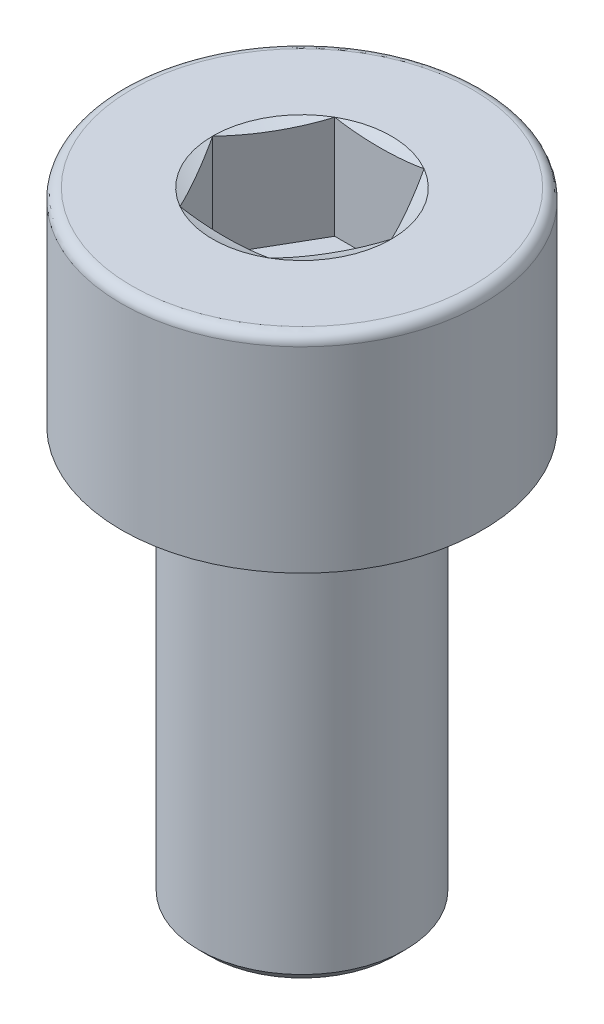
ISO-10303-21;
HEADER;
FILE_DESCRIPTION(('STEP AP214'),'2;1');
FILE_NAME('part.step','',(''),(''),'','','');
FILE_SCHEMA(('AUTOMOTIVE_DESIGN { 1 0 10303 214 1 1 1 1 }'));
ENDSEC;
DATA;
#1=APPLICATION_CONTEXT('core data for automotive mechanical design processes');
#2=APPLICATION_PROTOCOL_DEFINITION('international standard','automotive_design',2000,#1);
#3=PRODUCT_CONTEXT('',#1,'mechanical');
#4=PRODUCT('Part','Part','',(#3));
#5=PRODUCT_RELATED_PRODUCT_CATEGORY('part','',(#4));
#6=PRODUCT_DEFINITION_FORMATION('','',#4);
#7=PRODUCT_DEFINITION_CONTEXT('part definition',#1,'design');
#8=PRODUCT_DEFINITION('design','',#6,#7);
#9=PRODUCT_DEFINITION_SHAPE('','',#8);
#10=(LENGTH_UNIT() NAMED_UNIT(*) SI_UNIT(.MILLI.,.METRE.));
#11=(NAMED_UNIT(*) PLANE_ANGLE_UNIT() SI_UNIT($,.RADIAN.));
#12=(NAMED_UNIT(*) SI_UNIT($,.STERADIAN.) SOLID_ANGLE_UNIT());
#13=UNCERTAINTY_MEASURE_WITH_UNIT(LENGTH_MEASURE(1.E-05),#10,'distance_accuracy_value','');
#14=(GEOMETRIC_REPRESENTATION_CONTEXT(3) GLOBAL_UNCERTAINTY_ASSIGNED_CONTEXT((#13)) GLOBAL_UNIT_ASSIGNED_CONTEXT((#10,
#11,#12)) REPRESENTATION_CONTEXT('',''));
#15=CARTESIAN_POINT('',(0.,0.,0.));
#16=DIRECTION('',(0.,0.,1.));
#17=DIRECTION('',(1.,0.,0.));
#18=AXIS2_PLACEMENT_3D('',#15,#16,#17);
#19=CARTESIAN_POINT('',(-0.866025403784439,2.,-1.5));
#20=DIRECTION('',(0.,-1.,0.));
#21=DIRECTION('',(0.,0.,-1.));
#22=AXIS2_PLACEMENT_3D('',#19,#20,#21);
#23=PLANE('',#22);
#24=DIRECTION('',(0.5,0.,0.866025403784439));
#25=VECTOR('',#24,1.);
#26=CARTESIAN_POINT('',(-0.866025403784439,2.,1.5));
#27=LINE('',#26,#25);
#28=CARTESIAN_POINT('',(-1.73205080756888,2.,0.));
#29=VERTEX_POINT('',#28);
#30=CARTESIAN_POINT('',(-0.866025403784439,2.,1.5));
#31=VERTEX_POINT('',#30);
#32=EDGE_CURVE('E233',#29,#31,#27,.T.);
#33=ORIENTED_EDGE('',*,*,#32,.T.);
#34=DIRECTION('',(1.,0.,0.));
#35=VECTOR('',#34,1.);
#36=CARTESIAN_POINT('',(0.866025403784439,2.,1.5));
#37=LINE('',#36,#35);
#38=CARTESIAN_POINT('',(0.866025403784438,2.,1.5));
#39=VERTEX_POINT('',#38);
#40=EDGE_CURVE('E237',#31,#39,#37,.T.);
#41=ORIENTED_EDGE('',*,*,#40,.T.);
#42=DIRECTION('',(0.5,0.,-0.866025403784438));
#43=VECTOR('',#42,1.);
#44=CARTESIAN_POINT('',(1.73205080756888,2.,0.));
#45=LINE('',#44,#43);
#46=CARTESIAN_POINT('',(1.73205080756888,2.,0.));
#47=VERTEX_POINT('',#46);
#48=EDGE_CURVE('E240',#39,#47,#45,.T.);
#49=ORIENTED_EDGE('',*,*,#48,.T.);
#50=DIRECTION('',(-0.5,0.,-0.866025403784439));
#51=VECTOR('',#50,1.);
#52=CARTESIAN_POINT('',(0.866025403784439,2.,-1.5));
#53=LINE('',#52,#51);
#54=CARTESIAN_POINT('',(0.866025403784439,2.,-1.5));
#55=VERTEX_POINT('',#54);
#56=EDGE_CURVE('E96',#47,#55,#53,.T.);
#57=ORIENTED_EDGE('',*,*,#56,.T.);
#58=DIRECTION('',(-1.,0.,0.));
#59=VECTOR('',#58,1.);
#60=CARTESIAN_POINT('',(-0.866025403784439,2.,-1.5));
#61=LINE('',#60,#59);
#62=CARTESIAN_POINT('',(-0.866025403784439,2.,-1.5));
#63=VERTEX_POINT('',#62);
#64=EDGE_CURVE('E223',#55,#63,#61,.T.);
#65=ORIENTED_EDGE('',*,*,#64,.T.);
#66=DIRECTION('',(-0.5,0.,0.866025403784439));
#67=VECTOR('',#66,1.);
#68=CARTESIAN_POINT('',(-1.73205080756888,2.,0.));
#69=LINE('',#68,#67);
#70=EDGE_CURVE('E228',#63,#29,#69,.T.);
#71=ORIENTED_EDGE('',*,*,#70,.T.);
#72=EDGE_LOOP('',(#33,#41,#49,#57,#65,#71));
#73=FACE_BOUND('',#72,.T.);
#74=ADVANCED_FACE('F17',(#73),#23,.F.);
#75=CARTESIAN_POINT('',(1.73205080756888,2.,0.));
#76=DIRECTION('',(0.866025403784438,0.,0.5));
#77=DIRECTION('',(0.5,0.,-0.866025403784438));
#78=AXIS2_PLACEMENT_3D('',#75,#76,#77);
#79=PLANE('',#78);
#80=CARTESIAN_POINT('',(0.866025403784439,4.,1.5));
#81=CARTESIAN_POINT('',(0.915504075147133,3.98189582699173,1.41430042730881));
#82=CARTESIAN_POINT('',(0.965286089839679,3.96746130454607,1.32807544855818));
#83=CARTESIAN_POINT('',(1.04010320937937,3.95073670465878,1.19848839623948));
#84=CARTESIAN_POINT('',(1.06500195161915,3.94598898296402,1.15536250963562));
#85=CARTESIAN_POINT('',(1.11486455236407,3.93800945270095,1.0689979517479));
#86=CARTESIAN_POINT('',(1.13982842404438,3.93477797939708,1.02575925764398));
#87=CARTESIAN_POINT('',(1.2119715040795,3.92751872155022,0.900803777608636));
#88=CARTESIAN_POINT('',(1.25919960491255,3.92533045525273,0.819002307420801));
#89=CARTESIAN_POINT('',(1.35364574634637,3.92584627574942,0.655416791878586));
#90=CARTESIAN_POINT('',(1.40086378687052,3.92855039856217,0.573632746656925));
#91=CARTESIAN_POINT('',(1.4956233423575,3.9391641982793,0.409504382050834));
#92=CARTESIAN_POINT('',(1.54316353081018,3.94712430077153,0.327162360249381));
#93=CARTESIAN_POINT('',(1.63791125772031,3.96895972056791,0.163054483339385));
#94=CARTESIAN_POINT('',(1.68511871136698,3.98283649422536,0.0812887751273956));
#95=CARTESIAN_POINT('',(1.73205080756888,4.,0.));
#96=B_SPLINE_CURVE_WITH_KNOTS('',3,(#80,#81,#82,#83,#84,#85,#86,#87,#88,#89,#90,#91,#92,#93,#94,
#95),.UNSPECIFIED.,.F.,.F.,(4,2,2,2,2,2,2,4),(0.,0.301631287017592,0.4516759741211,
0.6017538226571,0.885054753264525,1.16835776958803,1.45441905905587,1.74055080148907),.UNSPECIFIED.);
#97=CARTESIAN_POINT('',(0.866025403784439,4.,1.5));
#98=VERTEX_POINT('',#97);
#99=CARTESIAN_POINT('',(1.73205080756888,4.,0.));
#100=VERTEX_POINT('',#99);
#101=EDGE_CURVE('E79',#98,#100,#96,.T.);
#102=ORIENTED_EDGE('',*,*,#101,.T.);
#103=DIRECTION('',(0.,1.,0.));
#104=VECTOR('',#103,1.);
#105=CARTESIAN_POINT('',(1.73205080756888,2.,0.));
#106=LINE('',#105,#104);
#107=EDGE_CURVE('E82',#100,#47,#106,.F.);
#108=ORIENTED_EDGE('',*,*,#107,.T.);
#109=ORIENTED_EDGE('',*,*,#48,.F.);
#110=DIRECTION('',(0.,1.,0.));
#111=VECTOR('',#110,1.);
#112=CARTESIAN_POINT('',(0.866025403784439,2.,1.5));
#113=LINE('',#112,#111);
#114=EDGE_CURVE('E75',#39,#98,#113,.T.);
#115=ORIENTED_EDGE('',*,*,#114,.T.);
#116=EDGE_LOOP('',(#102,#108,#109,#115));
#117=FACE_BOUND('',#116,.T.);
#118=ADVANCED_FACE('F81',(#117),#79,.F.);
#119=CARTESIAN_POINT('',(0.866025403784439,2.,1.5));
#120=DIRECTION('',(0.,0.,1.));
#121=DIRECTION('',(1.,0.,0.));
#122=AXIS2_PLACEMENT_3D('',#119,#120,#121);
#123=PLANE('',#122);
#124=CARTESIAN_POINT('',(-0.866025403784439,4.,1.5));
#125=CARTESIAN_POINT('',(-0.767068061059051,3.98189582699172,1.5));
#126=CARTESIAN_POINT('',(-0.667504031673958,3.96746130454607,1.5));
#127=CARTESIAN_POINT('',(-0.517869792594573,3.95073670465878,1.5));
#128=CARTESIAN_POINT('',(-0.46807230811501,3.94598898296402,1.5));
#129=CARTESIAN_POINT('',(-0.368347106625181,3.93800945270095,1.5));
#130=CARTESIAN_POINT('',(-0.318419363264562,3.93477797939708,1.5));
#131=CARTESIAN_POINT('',(-0.174133203194317,3.92751872155022,1.5));
#132=CARTESIAN_POINT('',(-0.0796770015282091,3.92533045525273,1.5));
#133=CARTESIAN_POINT('',(0.109215281339434,3.92584627574942,1.5));
#134=CARTESIAN_POINT('',(0.203651362387719,3.92855039856217,1.5));
#135=CARTESIAN_POINT('',(0.393170473361679,3.9391641982793,1.5));
#136=CARTESIAN_POINT('',(0.488250850267052,3.94712430077153,1.5));
#137=CARTESIAN_POINT('',(0.677746304087301,3.96895972056791,1.5));
#138=CARTESIAN_POINT('',(0.772161211380646,3.98283649422536,1.5));
#139=CARTESIAN_POINT('',(0.866025403784439,4.,1.5));
#140=B_SPLINE_CURVE_WITH_KNOTS('',3,(#124,#125,#126,#127,#128,#129,#130,#131,#132,#133,#134,
#135,#136,#137,#138,#139),.UNSPECIFIED.,.F.,.F.,(4,2,2,2,2,2,2,4),(0.,0.301631287017592,
0.4516759741211,0.6017538226571,0.885054753264526,1.16835776958803,1.45441905905588,
1.74055080148907),.UNSPECIFIED.);
#141=CARTESIAN_POINT('',(-0.866025403784439,4.,1.5));
#142=VERTEX_POINT('',#141);
#143=EDGE_CURVE('E87',#142,#98,#140,.T.);
#144=ORIENTED_EDGE('',*,*,#143,.T.);
#145=ORIENTED_EDGE('',*,*,#114,.F.);
#146=ORIENTED_EDGE('',*,*,#40,.F.);
#147=DIRECTION('',(0.,1.,0.));
#148=VECTOR('',#147,1.);
#149=CARTESIAN_POINT('',(-0.866025403784439,2.,1.5));
#150=LINE('',#149,#148);
#151=EDGE_CURVE('E231',#31,#142,#150,.T.);
#152=ORIENTED_EDGE('',*,*,#151,.T.);
#153=EDGE_LOOP('',(#144,#145,#146,#152));
#154=FACE_BOUND('',#153,.T.);
#155=ADVANCED_FACE('F195',(#154),#123,.F.);
#156=CARTESIAN_POINT('',(-0.866025403784439,2.,1.5));
#157=DIRECTION('',(-0.866025403784439,0.,0.5));
#158=DIRECTION('',(0.5,0.,0.866025403784439));
#159=AXIS2_PLACEMENT_3D('',#156,#157,#158);
#160=PLANE('',#159);
#161=CARTESIAN_POINT('',(-1.73205080756888,4.,0.));
#162=CARTESIAN_POINT('',(-1.68257213620618,3.98189582699173,0.0856995726911892));
#163=CARTESIAN_POINT('',(-1.63279012151364,3.96746130454607,0.17192455144182));
#164=CARTESIAN_POINT('',(-1.55797300197394,3.95073670465878,0.301511603760521));
#165=CARTESIAN_POINT('',(-1.53307425973416,3.94598898296402,0.344637490364384));
#166=CARTESIAN_POINT('',(-1.48321165898925,3.93800945270095,0.431002048252098));
#167=CARTESIAN_POINT('',(-1.45824778730894,3.93477797939708,0.474240742356024));
#168=CARTESIAN_POINT('',(-1.38610470727382,3.92751872155022,0.599196222391364));
#169=CARTESIAN_POINT('',(-1.33887660644076,3.92533045525273,0.6809976925792));
#170=CARTESIAN_POINT('',(-1.24443046500694,3.92584627574942,0.844583208121415));
#171=CARTESIAN_POINT('',(-1.1972124244828,3.92855039856217,0.926367253343075));
#172=CARTESIAN_POINT('',(-1.10245286899582,3.9391641982793,1.09049561794917));
#173=CARTESIAN_POINT('',(-1.05491268054313,3.94712430077153,1.17283763975062));
#174=CARTESIAN_POINT('',(-0.960164953633007,3.96895972056791,1.33694551666062));
#175=CARTESIAN_POINT('',(-0.912957499986335,3.98283649422536,1.41871122487261));
#176=CARTESIAN_POINT('',(-0.866025403784439,4.,1.5));
#177=B_SPLINE_CURVE_WITH_KNOTS('',3,(#161,#162,#163,#164,#165,#166,#167,#168,#169,#170,#171,
#172,#173,#174,#175,#176),.UNSPECIFIED.,.F.,.F.,(4,2,2,2,2,2,2,4),(0.,0.301631287017591,
0.4516759741211,0.6017538226571,0.885054753264526,1.16835776958803,1.45441905905588,
1.74055080148907),.UNSPECIFIED.);
#178=CARTESIAN_POINT('',(-1.73205080756888,4.,0.));
#179=VERTEX_POINT('',#178);
#180=EDGE_CURVE('E179',#179,#142,#177,.T.);
#181=ORIENTED_EDGE('',*,*,#180,.T.);
#182=ORIENTED_EDGE('',*,*,#151,.F.);
#183=ORIENTED_EDGE('',*,*,#32,.F.);
#184=DIRECTION('',(0.,1.,0.));
#185=VECTOR('',#184,1.);
#186=CARTESIAN_POINT('',(-1.73205080756888,2.,0.));
#187=LINE('',#186,#185);
#188=EDGE_CURVE('E226',#29,#179,#187,.T.);
#189=ORIENTED_EDGE('',*,*,#188,.T.);
#190=EDGE_LOOP('',(#181,#182,#183,#189));
#191=FACE_BOUND('',#190,.T.);
#192=ADVANCED_FACE('F189',(#191),#160,.F.);
#193=CARTESIAN_POINT('',(-1.73205080756888,2.,0.));
#194=DIRECTION('',(-0.866025403784439,0.,-0.5));
#195=DIRECTION('',(-0.5,0.,0.866025403784439));
#196=AXIS2_PLACEMENT_3D('',#193,#194,#195);
#197=PLANE('',#196);
#198=CARTESIAN_POINT('',(-0.866025403784439,4.,-1.5));
#199=CARTESIAN_POINT('',(-0.915504075147133,3.98189582699172,-1.41430042730881));
#200=CARTESIAN_POINT('',(-0.965286089839679,3.96746130454607,-1.32807544855818));
#201=CARTESIAN_POINT('',(-1.04010320937937,3.95073670465878,-1.19848839623948));
#202=CARTESIAN_POINT('',(-1.06500195161915,3.94598898296402,-1.15536250963562));
#203=CARTESIAN_POINT('',(-1.11486455236407,3.93800945270095,-1.0689979517479));
#204=CARTESIAN_POINT('',(-1.13982842404438,3.93477797939708,-1.02575925764398));
#205=CARTESIAN_POINT('',(-1.2119715040795,3.92751872155022,-0.900803777608636));
#206=CARTESIAN_POINT('',(-1.25919960491255,3.92533045525273,-0.819002307420801));
#207=CARTESIAN_POINT('',(-1.35364574634638,3.92584627574942,-0.655416791878586));
#208=CARTESIAN_POINT('',(-1.40086378687052,3.92855039856217,-0.573632746656925));
#209=CARTESIAN_POINT('',(-1.4956233423575,3.9391641982793,-0.409504382050833));
#210=CARTESIAN_POINT('',(-1.54316353081018,3.94712430077153,-0.327162360249381));
#211=CARTESIAN_POINT('',(-1.63791125772031,3.96895972056791,-0.163054483339384));
#212=CARTESIAN_POINT('',(-1.68511871136698,3.98283649422536,-0.081288775127395));
#213=CARTESIAN_POINT('',(-1.73205080756888,4.,0.));
#214=B_SPLINE_CURVE_WITH_KNOTS('',3,(#198,#199,#200,#201,#202,#203,#204,#205,#206,#207,#208,
#209,#210,#211,#212,#213),.UNSPECIFIED.,.F.,.F.,(4,2,2,2,2,2,2,4),(0.,0.301631287017592,
0.4516759741211,0.6017538226571,0.885054753264526,1.16835776958803,1.45441905905587,
1.74055080148907),.UNSPECIFIED.);
#215=CARTESIAN_POINT('',(-0.866025403784439,4.,-1.5));
#216=VERTEX_POINT('',#215);
#217=EDGE_CURVE('E172',#216,#179,#214,.T.);
#218=ORIENTED_EDGE('',*,*,#217,.T.);
#219=ORIENTED_EDGE('',*,*,#188,.F.);
#220=ORIENTED_EDGE('',*,*,#70,.F.);
#221=DIRECTION('',(0.,1.,0.));
#222=VECTOR('',#221,1.);
#223=CARTESIAN_POINT('',(-0.866025403784439,2.,-1.5));
#224=LINE('',#223,#222);
#225=EDGE_CURVE('E221',#63,#216,#224,.T.);
#226=ORIENTED_EDGE('',*,*,#225,.T.);
#227=EDGE_LOOP('',(#218,#219,#220,#226));
#228=FACE_BOUND('',#227,.T.);
#229=ADVANCED_FACE('F185',(#228),#197,.F.);
#230=CARTESIAN_POINT('',(-0.866025403784439,2.,-1.5));
#231=DIRECTION('',(0.,0.,-1.));
#232=DIRECTION('',(-1.,0.,0.));
#233=AXIS2_PLACEMENT_3D('',#230,#231,#232);
#234=PLANE('',#233);
#235=CARTESIAN_POINT('',(0.866025403784441,4.,-1.5));
#236=CARTESIAN_POINT('',(0.767068061059053,3.98189582699173,-1.5));
#237=CARTESIAN_POINT('',(0.66750403167396,3.96746130454607,-1.5));
#238=CARTESIAN_POINT('',(0.517869792594575,3.95073670465878,-1.5));
#239=CARTESIAN_POINT('',(0.468072308115012,3.94598898296402,-1.5));
#240=CARTESIAN_POINT('',(0.368347106625183,3.93800945270095,-1.5));
#241=CARTESIAN_POINT('',(0.318419363264564,3.93477797939708,-1.5));
#242=CARTESIAN_POINT('',(0.174133203194318,3.92751872155022,-1.5));
#243=CARTESIAN_POINT('',(0.0796770015282105,3.92533045525273,-1.5));
#244=CARTESIAN_POINT('',(-0.109215281339433,3.92584627574942,-1.5));
#245=CARTESIAN_POINT('',(-0.203651362387717,3.92855039856217,-1.5));
#246=CARTESIAN_POINT('',(-0.393170473361678,3.9391641982793,-1.5));
#247=CARTESIAN_POINT('',(-0.488250850267052,3.94712430077153,-1.5));
#248=CARTESIAN_POINT('',(-0.677746304087301,3.96895972056791,-1.5));
#249=CARTESIAN_POINT('',(-0.772161211380646,3.98283649422536,-1.5));
#250=CARTESIAN_POINT('',(-0.866025403784439,4.,-1.5));
#251=B_SPLINE_CURVE_WITH_KNOTS('',3,(#235,#236,#237,#238,#239,#240,#241,#242,#243,#244,#245,
#246,#247,#248,#249,#250),.UNSPECIFIED.,.F.,.F.,(4,2,2,2,2,2,2,4),(0.,0.301631287017592,
0.4516759741211,0.6017538226571,0.885054753264526,1.16835776958803,1.45441905905588,
1.74055080148907),.UNSPECIFIED.);
#252=CARTESIAN_POINT('',(0.86602540378444,4.,-1.5));
#253=VERTEX_POINT('',#252);
#254=EDGE_CURVE('E112',#253,#216,#251,.T.);
#255=ORIENTED_EDGE('',*,*,#254,.T.);
#256=ORIENTED_EDGE('',*,*,#225,.F.);
#257=ORIENTED_EDGE('',*,*,#64,.F.);
#258=DIRECTION('',(0.,1.,0.));
#259=VECTOR('',#258,1.);
#260=CARTESIAN_POINT('',(0.866025403784439,2.,-1.5));
#261=LINE('',#260,#259);
#262=EDGE_CURVE('E97',#55,#253,#261,.T.);
#263=ORIENTED_EDGE('',*,*,#262,.T.);
#264=EDGE_LOOP('',(#255,#256,#257,#263));
#265=FACE_BOUND('',#264,.T.);
#266=ADVANCED_FACE('F188',(#265),#234,.F.);
#267=CARTESIAN_POINT('',(0.866025403784439,2.,-1.5));
#268=DIRECTION('',(0.866025403784439,0.,-0.5));
#269=DIRECTION('',(-0.5,0.,-0.866025403784439));
#270=AXIS2_PLACEMENT_3D('',#267,#268,#269);
#271=PLANE('',#270);
#272=CARTESIAN_POINT('',(1.73205080756888,4.,0.));
#273=CARTESIAN_POINT('',(1.68257213620618,3.98189582699172,-0.0856995726911877));
#274=CARTESIAN_POINT('',(1.63279012151364,3.96746130454607,-0.171924551441818));
#275=CARTESIAN_POINT('',(1.55797300197395,3.95073670465878,-0.30151160376052));
#276=CARTESIAN_POINT('',(1.53307425973416,3.94598898296402,-0.344637490364383));
#277=CARTESIAN_POINT('',(1.48321165898925,3.93800945270096,-0.431002048252097));
#278=CARTESIAN_POINT('',(1.45824778730894,3.93477797939709,-0.474240742356023));
#279=CARTESIAN_POINT('',(1.38610470727382,3.92751872155022,-0.599196222391363));
#280=CARTESIAN_POINT('',(1.33887660644076,3.92533045525273,-0.680997692579198));
#281=CARTESIAN_POINT('',(1.24443046500694,3.92584627574942,-0.844583208121413));
#282=CARTESIAN_POINT('',(1.1972124244828,3.92855039856217,-0.926367253343074));
#283=CARTESIAN_POINT('',(1.10245286899582,3.9391641982793,-1.09049561794917));
#284=CARTESIAN_POINT('',(1.05491268054313,3.94712430077153,-1.17283763975062));
#285=CARTESIAN_POINT('',(0.960164953633009,3.96895972056791,-1.33694551666061));
#286=CARTESIAN_POINT('',(0.912957499986337,3.98283649422536,-1.4187112248726));
#287=CARTESIAN_POINT('',(0.86602540378444,4.,-1.5));
#288=B_SPLINE_CURVE_WITH_KNOTS('',3,(#272,#273,#274,#275,#276,#277,#278,#279,#280,#281,#282,
#283,#284,#285,#286,#287),.UNSPECIFIED.,.F.,.F.,(4,2,2,2,2,2,2,4),(0.,0.301631287017591,
0.4516759741211,0.601753822657099,0.885054753264525,1.16835776958803,1.45441905905587,
1.74055080148907),.UNSPECIFIED.);
#289=EDGE_CURVE('E94',#100,#253,#288,.T.);
#290=ORIENTED_EDGE('',*,*,#289,.T.);
#291=ORIENTED_EDGE('',*,*,#262,.F.);
#292=ORIENTED_EDGE('',*,*,#56,.F.);
#293=ORIENTED_EDGE('',*,*,#107,.F.);
#294=EDGE_LOOP('',(#290,#291,#292,#293));
#295=FACE_BOUND('',#294,.T.);
#296=ADVANCED_FACE('F91',(#295),#271,.F.);
#297=CARTESIAN_POINT('',(-0.700494946689941,6.81707161887772,0.));
#298=DIRECTION('',(0.,0.,1.));
#299=DIRECTION('',(-1.,0.,0.));
#300=AXIS2_PLACEMENT_3D('',#297,#298,#299);
#301=CIRCLE('',#300,3.);
#302=TRIMMED_CURVE('',#301,(PARAMETER_VALUE(-1.80647023251057)),
(PARAMETER_VALUE(1.80647023251057)),.T.,.PARAMETER.);
#303=CARTESIAN_POINT('',(0.,6.81707161887772,0.));
#304=DIRECTION('',(0.,1.,0.));
#305=AXIS1_PLACEMENT('',#303,#304);
#306=SURFACE_OF_REVOLUTION('',#302,#305);
#307=ORIENTED_EDGE('',*,*,#101,.F.);
#308=CARTESIAN_POINT('',(0.,4.,0.));
#309=DIRECTION('',(0.,1.,0.));
#310=DIRECTION('',(-1.,0.,0.));
#311=AXIS2_PLACEMENT_3D('',#308,#309,#310);
#312=CIRCLE('',#311,1.73205080756888);
#313=EDGE_CURVE('E100',#100,#98,#312,.F.);
#314=ORIENTED_EDGE('',*,*,#313,.F.);
#315=EDGE_LOOP('',(#307,#314));
#316=FACE_BOUND('',#315,.T.);
#317=ADVANCED_FACE('F101',(#316),#306,.T.);
#318=CARTESIAN_POINT('',(-0.700494946689941,6.81707161887772,0.));
#319=DIRECTION('',(0.,0.,1.));
#320=DIRECTION('',(-1.,0.,0.));
#321=AXIS2_PLACEMENT_3D('',#318,#319,#320);
#322=CIRCLE('',#321,3.);
#323=TRIMMED_CURVE('',#322,(PARAMETER_VALUE(-1.80647023251057)),
(PARAMETER_VALUE(1.80647023251057)),.T.,.PARAMETER.);
#324=CARTESIAN_POINT('',(0.,6.81707161887772,0.));
#325=DIRECTION('',(0.,1.,0.));
#326=AXIS1_PLACEMENT('',#324,#325);
#327=SURFACE_OF_REVOLUTION('',#323,#326);
#328=ORIENTED_EDGE('',*,*,#143,.F.);
#329=CARTESIAN_POINT('',(0.,4.,0.));
#330=DIRECTION('',(0.,1.,0.));
#331=DIRECTION('',(-1.,0.,0.));
#332=AXIS2_PLACEMENT_3D('',#329,#330,#331);
#333=CIRCLE('',#332,1.73205080756888);
#334=EDGE_CURVE('E105',#98,#142,#333,.F.);
#335=ORIENTED_EDGE('',*,*,#334,.F.);
#336=EDGE_LOOP('',(#328,#335));
#337=FACE_BOUND('',#336,.T.);
#338=ADVANCED_FACE('F207',(#337),#327,.T.);
#339=CARTESIAN_POINT('',(-0.700494946689941,6.81707161887772,0.));
#340=DIRECTION('',(0.,0.,1.));
#341=DIRECTION('',(-1.,0.,0.));
#342=AXIS2_PLACEMENT_3D('',#339,#340,#341);
#343=CIRCLE('',#342,3.);
#344=TRIMMED_CURVE('',#343,(PARAMETER_VALUE(-1.80647023251057)),
(PARAMETER_VALUE(1.80647023251057)),.T.,.PARAMETER.);
#345=CARTESIAN_POINT('',(0.,6.81707161887772,0.));
#346=DIRECTION('',(0.,1.,0.));
#347=AXIS1_PLACEMENT('',#345,#346);
#348=SURFACE_OF_REVOLUTION('',#344,#347);
#349=ORIENTED_EDGE('',*,*,#180,.F.);
#350=CARTESIAN_POINT('',(0.,4.,0.));
#351=DIRECTION('',(0.,1.,0.));
#352=DIRECTION('',(-1.,0.,0.));
#353=AXIS2_PLACEMENT_3D('',#350,#351,#352);
#354=CIRCLE('',#353,1.73205080756888);
#355=EDGE_CURVE('E127',#142,#179,#354,.F.);
#356=ORIENTED_EDGE('',*,*,#355,.F.);
#357=EDGE_LOOP('',(#349,#356));
#358=FACE_BOUND('',#357,.T.);
#359=ADVANCED_FACE('F168',(#358),#348,.T.);
#360=CARTESIAN_POINT('',(-0.700494946689941,6.81707161887772,0.));
#361=DIRECTION('',(0.,0.,1.));
#362=DIRECTION('',(-1.,0.,0.));
#363=AXIS2_PLACEMENT_3D('',#360,#361,#362);
#364=CIRCLE('',#363,3.);
#365=TRIMMED_CURVE('',#364,(PARAMETER_VALUE(-1.80647023251057)),
(PARAMETER_VALUE(1.80647023251057)),.T.,.PARAMETER.);
#366=CARTESIAN_POINT('',(0.,6.81707161887772,0.));
#367=DIRECTION('',(0.,1.,0.));
#368=AXIS1_PLACEMENT('',#366,#367);
#369=SURFACE_OF_REVOLUTION('',#365,#368);
#370=ORIENTED_EDGE('',*,*,#217,.F.);
#371=CARTESIAN_POINT('',(0.,4.,0.));
#372=DIRECTION('',(0.,1.,0.));
#373=DIRECTION('',(-1.,0.,0.));
#374=AXIS2_PLACEMENT_3D('',#371,#372,#373);
#375=CIRCLE('',#374,1.73205080756888);
#376=EDGE_CURVE('E120',#179,#216,#375,.F.);
#377=ORIENTED_EDGE('',*,*,#376,.F.);
#378=EDGE_LOOP('',(#370,#377));
#379=FACE_BOUND('',#378,.T.);
#380=ADVANCED_FACE('F164',(#379),#369,.T.);
#381=CARTESIAN_POINT('',(-0.700494946689941,6.81707161887772,0.));
#382=DIRECTION('',(0.,0.,1.));
#383=DIRECTION('',(-1.,0.,0.));
#384=AXIS2_PLACEMENT_3D('',#381,#382,#383);
#385=CIRCLE('',#384,3.);
#386=TRIMMED_CURVE('',#385,(PARAMETER_VALUE(-1.80647023251057)),
(PARAMETER_VALUE(1.80647023251057)),.T.,.PARAMETER.);
#387=CARTESIAN_POINT('',(0.,6.81707161887772,0.));
#388=DIRECTION('',(0.,1.,0.));
#389=AXIS1_PLACEMENT('',#387,#388);
#390=SURFACE_OF_REVOLUTION('',#386,#389);
#391=ORIENTED_EDGE('',*,*,#254,.F.);
#392=CARTESIAN_POINT('',(0.,4.,0.));
#393=DIRECTION('',(0.,1.,0.));
#394=DIRECTION('',(-1.,0.,0.));
#395=AXIS2_PLACEMENT_3D('',#392,#393,#394);
#396=CIRCLE('',#395,1.73205080756888);
#397=EDGE_CURVE('E117',#216,#253,#396,.F.);
#398=ORIENTED_EDGE('',*,*,#397,.F.);
#399=EDGE_LOOP('',(#391,#398));
#400=FACE_BOUND('',#399,.T.);
#401=ADVANCED_FACE('F148',(#400),#390,.T.);
#402=CARTESIAN_POINT('',(-0.700494946689941,6.81707161887772,0.));
#403=DIRECTION('',(0.,0.,1.));
#404=DIRECTION('',(-1.,0.,0.));
#405=AXIS2_PLACEMENT_3D('',#402,#403,#404);
#406=CIRCLE('',#405,3.);
#407=TRIMMED_CURVE('',#406,(PARAMETER_VALUE(-1.80647023251057)),
(PARAMETER_VALUE(1.80647023251057)),.T.,.PARAMETER.);
#408=CARTESIAN_POINT('',(0.,6.81707161887772,0.));
#409=DIRECTION('',(0.,1.,0.));
#410=AXIS1_PLACEMENT('',#408,#409);
#411=SURFACE_OF_REVOLUTION('',#407,#410);
#412=ORIENTED_EDGE('',*,*,#289,.F.);
#413=CARTESIAN_POINT('',(0.,4.,0.));
#414=DIRECTION('',(0.,1.,0.));
#415=DIRECTION('',(-1.,0.,0.));
#416=AXIS2_PLACEMENT_3D('',#413,#414,#415);
#417=CIRCLE('',#416,1.73205080756888);
#418=EDGE_CURVE('E110',#253,#100,#417,.F.);
#419=ORIENTED_EDGE('',*,*,#418,.F.);
#420=EDGE_LOOP('',(#412,#419));
#421=FACE_BOUND('',#420,.T.);
#422=ADVANCED_FACE('F109',(#421),#411,.T.);
#423=CARTESIAN_POINT('',(0.,4.,0.));
#424=DIRECTION('',(0.,1.,0.));
#425=DIRECTION('',(0.,0.,1.));
#426=AXIS2_PLACEMENT_3D('',#423,#424,#425);
#427=PLANE('',#426);
#428=CARTESIAN_POINT('',(0.,4.,0.));
#429=DIRECTION('',(0.,-1.,0.));
#430=DIRECTION('',(0.,0.,-1.));
#431=AXIS2_PLACEMENT_3D('',#428,#429,#430);
#432=CIRCLE('',#431,3.3);
#433=CARTESIAN_POINT('',(0.,4.,-3.3));
#434=VERTEX_POINT('',#433);
#435=CARTESIAN_POINT('',(0.,4.,3.3));
#436=VERTEX_POINT('',#435);
#437=EDGE_CURVE('E36',#434,#436,#432,.T.);
#438=ORIENTED_EDGE('',*,*,#437,.F.);
#439=CARTESIAN_POINT('',(0.,4.,0.));
#440=DIRECTION('',(0.,-1.,0.));
#441=DIRECTION('',(0.,0.,1.));
#442=AXIS2_PLACEMENT_3D('',#439,#440,#441);
#443=CIRCLE('',#442,3.3);
#444=EDGE_CURVE('E119',#436,#434,#443,.T.);
#445=ORIENTED_EDGE('',*,*,#444,.F.);
#446=EDGE_LOOP('',(#438,#445));
#447=FACE_BOUND('',#446,.T.);
#448=ORIENTED_EDGE('',*,*,#397,.T.);
#449=ORIENTED_EDGE('',*,*,#418,.T.);
#450=ORIENTED_EDGE('',*,*,#313,.T.);
#451=ORIENTED_EDGE('',*,*,#334,.T.);
#452=ORIENTED_EDGE('',*,*,#355,.T.);
#453=ORIENTED_EDGE('',*,*,#376,.T.);
#454=EDGE_LOOP('',(#448,#449,#450,#451,#452,#453));
#455=FACE_BOUND('',#454,.T.);
#456=ADVANCED_FACE('F114',(#447,#455),#427,.T.);
#457=CARTESIAN_POINT('',(0.,3.8,0.));
#458=DIRECTION('',(0.,1.,0.));
#459=DIRECTION('',(0.,0.,1.));
#460=AXIS2_PLACEMENT_3D('',#457,#458,#459);
#461=TOROIDAL_SURFACE('',#460,3.3,0.2);
#462=CARTESIAN_POINT('',(0.,3.8,0.));
#463=DIRECTION('',(0.,-1.,0.));
#464=DIRECTION('',(0.,0.,-1.));
#465=AXIS2_PLACEMENT_3D('',#462,#463,#464);
#466=CIRCLE('',#465,3.5);
#467=CARTESIAN_POINT('',(0.,3.8,-3.5));
#468=VERTEX_POINT('',#467);
#469=EDGE_CURVE('E265',#468,#468,#466,.T.);
#470=ORIENTED_EDGE('',*,*,#469,.F.);
#471=EDGE_LOOP('',(#470));
#472=FACE_BOUND('',#471,.T.);
#473=ORIENTED_EDGE('',*,*,#444,.T.);
#474=ORIENTED_EDGE('',*,*,#437,.T.);
#475=EDGE_LOOP('',(#473,#474));
#476=FACE_BOUND('',#475,.T.);
#477=ADVANCED_FACE('F276',(#472,#476),#461,.T.);
#478=CARTESIAN_POINT('',(0.,-8.,0.));
#479=DIRECTION('',(0.,-1.,0.));
#480=DIRECTION('',(0.,0.,-1.));
#481=AXIS2_PLACEMENT_3D('',#478,#479,#480);
#482=PLANE('',#481);
#483=CARTESIAN_POINT('',(0.,-7.99999999998136,0.));
#484=DIRECTION('',(0.,1.,0.));
#485=DIRECTION('',(0.,0.,1.));
#486=AXIS2_PLACEMENT_3D('',#483,#484,#485);
#487=CIRCLE('',#486,1.80000000005975);
#488=CARTESIAN_POINT('',(0.,-7.99999999998136,1.80000000005975));
#489=VERTEX_POINT('',#488);
#490=EDGE_CURVE('E123',#489,#489,#487,.T.);
#491=ORIENTED_EDGE('',*,*,#490,.F.);
#492=EDGE_LOOP('',(#491));
#493=FACE_BOUND('',#492,.T.);
#494=ADVANCED_FACE('F280',(#493),#482,.T.);
#495=CARTESIAN_POINT('',(0.,4.,0.));
#496=DIRECTION('',(0.,-1.,0.));
#497=DIRECTION('',(0.,0.,-1.));
#498=AXIS2_PLACEMENT_3D('',#495,#496,#497);
#499=CYLINDRICAL_SURFACE('',#498,3.5);
#500=ORIENTED_EDGE('',*,*,#469,.T.);
#501=EDGE_LOOP('',(#500));
#502=FACE_BOUND('',#501,.T.);
#503=CARTESIAN_POINT('',(0.,0.,0.));
#504=DIRECTION('',(0.,-1.,0.));
#505=DIRECTION('',(0.,0.,-1.));
#506=AXIS2_PLACEMENT_3D('',#503,#504,#505);
#507=CIRCLE('',#506,3.5);
#508=CARTESIAN_POINT('',(0.,0.,-3.5));
#509=VERTEX_POINT('',#508);
#510=EDGE_CURVE('E258',#509,#509,#507,.F.);
#511=ORIENTED_EDGE('',*,*,#510,.T.);
#512=EDGE_LOOP('',(#511));
#513=FACE_BOUND('',#512,.T.);
#514=ADVANCED_FACE('F285',(#502,#513),#499,.T.);
#515=CARTESIAN_POINT('',(0.,-7.80000000003156,0.));
#516=DIRECTION('',(0.,1.,0.));
#517=DIRECTION('',(0.,0.,1.));
#518=AXIS2_PLACEMENT_3D('',#515,#516,#517);
#519=CONICAL_SURFACE('',#518,2.00000000000955,0.785398163397448);
#520=CARTESIAN_POINT('',(0.,-7.8,0.));
#521=DIRECTION('',(0.,1.,0.));
#522=DIRECTION('',(0.,0.,1.));
#523=AXIS2_PLACEMENT_3D('',#520,#521,#522);
#524=CIRCLE('',#523,2.);
#525=CARTESIAN_POINT('',(0.,-7.8,2.));
#526=VERTEX_POINT('',#525);
#527=EDGE_CURVE('E28',#526,#526,#524,.T.);
#528=ORIENTED_EDGE('',*,*,#527,.F.);
#529=EDGE_LOOP('',(#528));
#530=FACE_BOUND('',#529,.T.);
#531=ORIENTED_EDGE('',*,*,#490,.T.);
#532=EDGE_LOOP('',(#531));
#533=FACE_BOUND('',#532,.T.);
#534=ADVANCED_FACE('F289',(#530,#533),#519,.T.);
#535=CARTESIAN_POINT('',(0.,0.,0.));
#536=DIRECTION('',(0.,1.,0.));
#537=DIRECTION('',(0.,0.,1.));
#538=AXIS2_PLACEMENT_3D('',#535,#536,#537);
#539=PLANE('',#538);
#540=CARTESIAN_POINT('',(0.,0.,0.));
#541=DIRECTION('',(0.,1.,0.));
#542=DIRECTION('',(0.,0.,1.));
#543=AXIS2_PLACEMENT_3D('',#540,#541,#542);
#544=CIRCLE('',#543,2.);
#545=CARTESIAN_POINT('',(0.,0.,2.));
#546=VERTEX_POINT('',#545);
#547=EDGE_CURVE('E11',#546,#546,#544,.F.);
#548=ORIENTED_EDGE('',*,*,#547,.F.);
#549=EDGE_LOOP('',(#548));
#550=FACE_BOUND('',#549,.T.);
#551=ORIENTED_EDGE('',*,*,#510,.F.);
#552=EDGE_LOOP('',(#551));
#553=FACE_BOUND('',#552,.T.);
#554=ADVANCED_FACE('F292',(#550,#553),#539,.F.);
#555=CARTESIAN_POINT('',(0.,-8.,0.));
#556=DIRECTION('',(0.,1.,0.));
#557=DIRECTION('',(0.,0.,1.));
#558=AXIS2_PLACEMENT_3D('',#555,#556,#557);
#559=CYLINDRICAL_SURFACE('',#558,2.);
#560=ORIENTED_EDGE('',*,*,#547,.T.);
#561=EDGE_LOOP('',(#560));
#562=FACE_BOUND('',#561,.T.);
#563=ORIENTED_EDGE('',*,*,#527,.T.);
#564=EDGE_LOOP('',(#563));
#565=FACE_BOUND('',#564,.T.);
#566=ADVANCED_FACE('F296',(#562,#565),#559,.T.);
#567=CLOSED_SHELL('',(#74,#118,#155,#192,#229,#266,#296,#317,#338,#359,#380,#401,#422,#456,#477,
#494,#514,#534,#554,#566));
#568=MANIFOLD_SOLID_BREP('B1',#567);
#569=ADVANCED_BREP_SHAPE_REPRESENTATION('',(#18,#568),#14);
#570=SHAPE_DEFINITION_REPRESENTATION(#9,#569);
ENDSEC;
END-ISO-10303-21;
